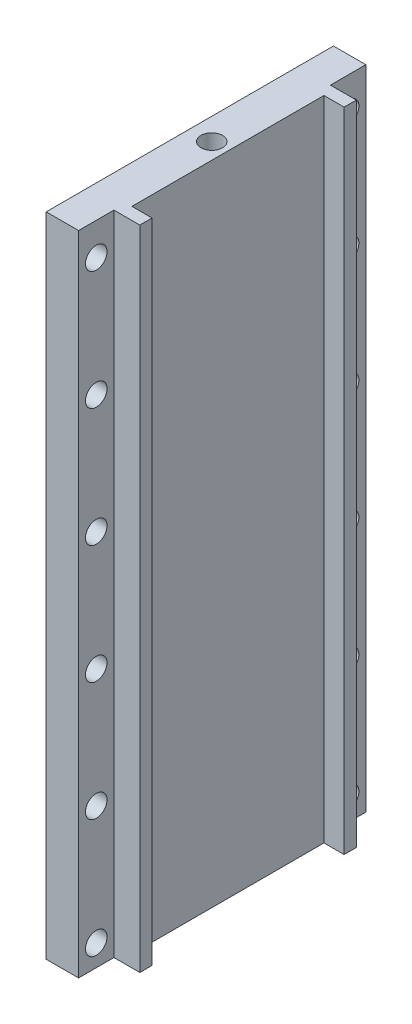
ISO-10303-21;
HEADER;
FILE_DESCRIPTION(('STEP AP214'),'2;1');
FILE_NAME('part.step','',(''),(''),'','','');
FILE_SCHEMA(('AUTOMOTIVE_DESIGN { 1 0 10303 214 1 1 1 1 }'));
ENDSEC;
DATA;
#1=APPLICATION_CONTEXT('core data for automotive mechanical design processes');
#2=APPLICATION_PROTOCOL_DEFINITION('international standard','automotive_design',2000,#1);
#3=PRODUCT_CONTEXT('',#1,'mechanical');
#4=PRODUCT('Part','Part','',(#3));
#5=PRODUCT_RELATED_PRODUCT_CATEGORY('part','',(#4));
#6=PRODUCT_DEFINITION_FORMATION('','',#4);
#7=PRODUCT_DEFINITION_CONTEXT('part definition',#1,'design');
#8=PRODUCT_DEFINITION('design','',#6,#7);
#9=PRODUCT_DEFINITION_SHAPE('','',#8);
#10=(LENGTH_UNIT() NAMED_UNIT(*) SI_UNIT(.MILLI.,.METRE.));
#11=(NAMED_UNIT(*) PLANE_ANGLE_UNIT() SI_UNIT($,.RADIAN.));
#12=(NAMED_UNIT(*) SI_UNIT($,.STERADIAN.) SOLID_ANGLE_UNIT());
#13=UNCERTAINTY_MEASURE_WITH_UNIT(LENGTH_MEASURE(1.E-05),#10,'distance_accuracy_value','');
#14=(GEOMETRIC_REPRESENTATION_CONTEXT(3) GLOBAL_UNCERTAINTY_ASSIGNED_CONTEXT((#13)) GLOBAL_UNIT_ASSIGNED_CONTEXT((#10,
#11,#12)) REPRESENTATION_CONTEXT('',''));
#15=CARTESIAN_POINT('',(0.,0.,0.));
#16=DIRECTION('',(0.,0.,1.));
#17=DIRECTION('',(1.,0.,0.));
#18=AXIS2_PLACEMENT_3D('',#15,#16,#17);
#19=CARTESIAN_POINT('',(0.,300.,0.));
#20=DIRECTION('',(0.,0.,-1.));
#21=DIRECTION('',(-1.,0.,0.));
#22=AXIS2_PLACEMENT_3D('',#19,#20,#21);
#23=PLANE('',#22);
#24=DIRECTION('',(1.,0.,0.));
#25=VECTOR('',#24,1.);
#26=CARTESIAN_POINT('',(0.,0.,0.));
#27=LINE('',#26,#25);
#28=CARTESIAN_POINT('',(0.,0.,0.));
#29=VERTEX_POINT('',#28);
#30=CARTESIAN_POINT('',(15.,0.,0.));
#31=VERTEX_POINT('',#30);
#32=EDGE_CURVE('E164',#29,#31,#27,.T.);
#33=ORIENTED_EDGE('',*,*,#32,.T.);
#34=DIRECTION('',(0.,-1.,0.));
#35=VECTOR('',#34,1.);
#36=CARTESIAN_POINT('',(15.,300.,0.));
#37=LINE('',#36,#35);
#38=CARTESIAN_POINT('',(15.,300.,0.));
#39=VERTEX_POINT('',#38);
#40=EDGE_CURVE('E13',#39,#31,#37,.T.);
#41=ORIENTED_EDGE('',*,*,#40,.F.);
#42=DIRECTION('',(1.,0.,0.));
#43=VECTOR('',#42,1.);
#44=CARTESIAN_POINT('',(0.,300.,0.));
#45=LINE('',#44,#43);
#46=CARTESIAN_POINT('',(0.,300.,0.));
#47=VERTEX_POINT('',#46);
#48=EDGE_CURVE('E187',#47,#39,#45,.T.);
#49=ORIENTED_EDGE('',*,*,#48,.F.);
#50=DIRECTION('',(0.,-1.,0.));
#51=VECTOR('',#50,1.);
#52=CARTESIAN_POINT('',(0.,300.,0.));
#53=LINE('',#52,#51);
#54=EDGE_CURVE('E160',#47,#29,#53,.T.);
#55=ORIENTED_EDGE('',*,*,#54,.T.);
#56=EDGE_LOOP('',(#33,#41,#49,#55));
#57=FACE_BOUND('',#56,.T.);
#58=ADVANCED_FACE('F44',(#57),#23,.F.);
#59=CARTESIAN_POINT('',(15.,300.,0.));
#60=DIRECTION('',(-1.,0.,0.));
#61=DIRECTION('',(0.,0.,1.));
#62=AXIS2_PLACEMENT_3D('',#59,#60,#61);
#63=PLANE('',#62);
#64=CARTESIAN_POINT('',(15.,230.,-8.19750000000057));
#65=DIRECTION('',(1.,0.,0.));
#66=DIRECTION('',(0.,0.,-1.));
#67=AXIS2_PLACEMENT_3D('',#64,#65,#66);
#68=CIRCLE('',#67,5.);
#69=CARTESIAN_POINT('',(15.,230.,-13.1975000000006));
#70=VERTEX_POINT('',#69);
#71=EDGE_CURVE('E346',#70,#70,#68,.T.);
#72=ORIENTED_EDGE('',*,*,#71,.F.);
#73=EDGE_LOOP('',(#72));
#74=FACE_BOUND('',#73,.T.);
#75=CARTESIAN_POINT('',(15.,175.,-8.19750000000115));
#76=DIRECTION('',(1.,0.,0.));
#77=DIRECTION('',(0.,0.,-1.));
#78=AXIS2_PLACEMENT_3D('',#75,#76,#77);
#79=CIRCLE('',#78,5.);
#80=CARTESIAN_POINT('',(15.,175.,-13.1975000000011));
#81=VERTEX_POINT('',#80);
#82=EDGE_CURVE('E356',#81,#81,#79,.T.);
#83=ORIENTED_EDGE('',*,*,#82,.F.);
#84=EDGE_LOOP('',(#83));
#85=FACE_BOUND('',#84,.T.);
#86=CARTESIAN_POINT('',(15.,120.,-8.19750000000172));
#87=DIRECTION('',(1.,0.,0.));
#88=DIRECTION('',(0.,0.,-1.));
#89=AXIS2_PLACEMENT_3D('',#86,#87,#88);
#90=CIRCLE('',#89,5.);
#91=CARTESIAN_POINT('',(15.,120.,-13.1975000000017));
#92=VERTEX_POINT('',#91);
#93=EDGE_CURVE('E362',#92,#92,#90,.T.);
#94=ORIENTED_EDGE('',*,*,#93,.F.);
#95=EDGE_LOOP('',(#94));
#96=FACE_BOUND('',#95,.T.);
#97=CARTESIAN_POINT('',(15.,65.,-8.1975000000023));
#98=DIRECTION('',(1.,0.,0.));
#99=DIRECTION('',(0.,0.,-1.));
#100=AXIS2_PLACEMENT_3D('',#97,#98,#99);
#101=CIRCLE('',#100,5.);
#102=CARTESIAN_POINT('',(15.,65.,-13.1975000000023));
#103=VERTEX_POINT('',#102);
#104=EDGE_CURVE('E368',#103,#103,#101,.T.);
#105=ORIENTED_EDGE('',*,*,#104,.F.);
#106=EDGE_LOOP('',(#105));
#107=FACE_BOUND('',#106,.T.);
#108=CARTESIAN_POINT('',(15.,9.99999999999995,-8.19750000000287));
#109=DIRECTION('',(1.,0.,0.));
#110=DIRECTION('',(0.,0.,-1.));
#111=AXIS2_PLACEMENT_3D('',#108,#109,#110);
#112=CIRCLE('',#111,5.);
#113=CARTESIAN_POINT('',(15.,9.99999999999995,-13.1975000000029));
#114=VERTEX_POINT('',#113);
#115=EDGE_CURVE('E374',#114,#114,#112,.T.);
#116=ORIENTED_EDGE('',*,*,#115,.F.);
#117=EDGE_LOOP('',(#116));
#118=FACE_BOUND('',#117,.T.);
#119=CARTESIAN_POINT('',(15.,285.,-8.19749999999999));
#120=DIRECTION('',(1.,0.,0.));
#121=DIRECTION('',(0.,0.,-1.));
#122=AXIS2_PLACEMENT_3D('',#119,#120,#121);
#123=CIRCLE('',#122,5.);
#124=CARTESIAN_POINT('',(15.,285.,-13.1975));
#125=VERTEX_POINT('',#124);
#126=EDGE_CURVE('E339',#125,#125,#123,.T.);
#127=ORIENTED_EDGE('',*,*,#126,.F.);
#128=EDGE_LOOP('',(#127));
#129=FACE_BOUND('',#128,.T.);
#130=DIRECTION('',(0.,0.,-1.));
#131=VECTOR('',#130,1.);
#132=CARTESIAN_POINT('',(15.,0.,0.));
#133=LINE('',#132,#131);
#134=CARTESIAN_POINT('',(15.,0.,-16.395));
#135=VERTEX_POINT('',#134);
#136=EDGE_CURVE('E167',#31,#135,#133,.T.);
#137=ORIENTED_EDGE('',*,*,#136,.T.);
#138=DIRECTION('',(0.,-1.,0.));
#139=VECTOR('',#138,1.);
#140=CARTESIAN_POINT('',(15.,300.,-16.395));
#141=LINE('',#140,#139);
#142=CARTESIAN_POINT('',(15.,300.,-16.395));
#143=VERTEX_POINT('',#142);
#144=EDGE_CURVE('E52',#143,#135,#141,.T.);
#145=ORIENTED_EDGE('',*,*,#144,.F.);
#146=DIRECTION('',(0.,0.,-1.));
#147=VECTOR('',#146,1.);
#148=CARTESIAN_POINT('',(15.,300.,0.));
#149=LINE('',#148,#147);
#150=EDGE_CURVE('E115',#39,#143,#149,.T.);
#151=ORIENTED_EDGE('',*,*,#150,.F.);
#152=ORIENTED_EDGE('',*,*,#40,.T.);
#153=EDGE_LOOP('',(#137,#145,#151,#152));
#154=FACE_BOUND('',#153,.T.);
#155=ADVANCED_FACE('F271',(#74,#85,#96,#107,#118,#129,#154),#63,.F.);
#156=CARTESIAN_POINT('',(15.,300.,-16.395));
#157=DIRECTION('',(0.,0.,-1.));
#158=DIRECTION('',(-1.,0.,0.));
#159=AXIS2_PLACEMENT_3D('',#156,#157,#158);
#160=PLANE('',#159);
#161=DIRECTION('',(1.,0.,0.));
#162=VECTOR('',#161,1.);
#163=CARTESIAN_POINT('',(15.,0.,-16.395));
#164=LINE('',#163,#162);
#165=CARTESIAN_POINT('',(27.,0.,-16.395));
#166=VERTEX_POINT('',#165);
#167=EDGE_CURVE('E170',#135,#166,#164,.T.);
#168=ORIENTED_EDGE('',*,*,#167,.T.);
#169=DIRECTION('',(0.,-1.,0.));
#170=VECTOR('',#169,1.);
#171=CARTESIAN_POINT('',(27.,300.,-16.395));
#172=LINE('',#171,#170);
#173=CARTESIAN_POINT('',(27.,300.,-16.395));
#174=VERTEX_POINT('',#173);
#175=EDGE_CURVE('E206',#174,#166,#172,.T.);
#176=ORIENTED_EDGE('',*,*,#175,.F.);
#177=DIRECTION('',(1.,0.,0.));
#178=VECTOR('',#177,1.);
#179=CARTESIAN_POINT('',(15.,300.,-16.395));
#180=LINE('',#179,#178);
#181=EDGE_CURVE('E214',#143,#174,#180,.T.);
#182=ORIENTED_EDGE('',*,*,#181,.F.);
#183=ORIENTED_EDGE('',*,*,#144,.T.);
#184=EDGE_LOOP('',(#168,#176,#182,#183));
#185=FACE_BOUND('',#184,.T.);
#186=ADVANCED_FACE('F212',(#185),#160,.F.);
#187=CARTESIAN_POINT('',(27.,300.,-16.395));
#188=DIRECTION('',(-1.,0.,0.));
#189=DIRECTION('',(0.,0.,1.));
#190=AXIS2_PLACEMENT_3D('',#187,#188,#189);
#191=PLANE('',#190);
#192=DIRECTION('',(0.,0.,-1.));
#193=VECTOR('',#192,1.);
#194=CARTESIAN_POINT('',(27.,0.,-16.395));
#195=LINE('',#194,#193);
#196=CARTESIAN_POINT('',(27.,0.,-22.06));
#197=VERTEX_POINT('',#196);
#198=EDGE_CURVE('E172',#166,#197,#195,.T.);
#199=ORIENTED_EDGE('',*,*,#198,.T.);
#200=DIRECTION('',(0.,-1.,0.));
#201=VECTOR('',#200,1.);
#202=CARTESIAN_POINT('',(27.,300.,-22.06));
#203=LINE('',#202,#201);
#204=CARTESIAN_POINT('',(27.,300.,-22.06));
#205=VERTEX_POINT('',#204);
#206=EDGE_CURVE('E203',#205,#197,#203,.T.);
#207=ORIENTED_EDGE('',*,*,#206,.F.);
#208=DIRECTION('',(0.,0.,-1.));
#209=VECTOR('',#208,1.);
#210=CARTESIAN_POINT('',(27.,300.,-16.395));
#211=LINE('',#210,#209);
#212=EDGE_CURVE('E232',#174,#205,#211,.T.);
#213=ORIENTED_EDGE('',*,*,#212,.F.);
#214=ORIENTED_EDGE('',*,*,#175,.T.);
#215=EDGE_LOOP('',(#199,#207,#213,#214));
#216=FACE_BOUND('',#215,.T.);
#217=ADVANCED_FACE('F223',(#216),#191,.F.);
#218=CARTESIAN_POINT('',(17.665,300.,-22.06));
#219=DIRECTION('',(0.,0.,1.));
#220=DIRECTION('',(1.,0.,0.));
#221=AXIS2_PLACEMENT_3D('',#218,#219,#220);
#222=PLANE('',#221);
#223=DIRECTION('',(-1.,0.,0.));
#224=VECTOR('',#223,1.);
#225=CARTESIAN_POINT('',(17.665,0.,-22.06));
#226=LINE('',#225,#224);
#227=CARTESIAN_POINT('',(17.665,0.,-22.06));
#228=VERTEX_POINT('',#227);
#229=EDGE_CURVE('E174',#197,#228,#226,.T.);
#230=ORIENTED_EDGE('',*,*,#229,.T.);
#231=DIRECTION('',(0.,-1.,0.));
#232=VECTOR('',#231,1.);
#233=CARTESIAN_POINT('',(17.665,300.,-22.06));
#234=LINE('',#233,#232);
#235=CARTESIAN_POINT('',(17.665,300.,-22.06));
#236=VERTEX_POINT('',#235);
#237=EDGE_CURVE('E200',#236,#228,#234,.T.);
#238=ORIENTED_EDGE('',*,*,#237,.F.);
#239=DIRECTION('',(-1.,0.,0.));
#240=VECTOR('',#239,1.);
#241=CARTESIAN_POINT('',(17.665,300.,-22.06));
#242=LINE('',#241,#240);
#243=EDGE_CURVE('E229',#205,#236,#242,.T.);
#244=ORIENTED_EDGE('',*,*,#243,.F.);
#245=ORIENTED_EDGE('',*,*,#206,.T.);
#246=EDGE_LOOP('',(#230,#238,#244,#245));
#247=FACE_BOUND('',#246,.T.);
#248=ADVANCED_FACE('F227',(#247),#222,.F.);
#249=CARTESIAN_POINT('',(17.665,300.,-111.06));
#250=DIRECTION('',(-1.,0.,0.));
#251=DIRECTION('',(0.,0.,1.));
#252=AXIS2_PLACEMENT_3D('',#249,#250,#251);
#253=PLANE('',#252);
#254=DIRECTION('',(0.,0.,-1.));
#255=VECTOR('',#254,1.);
#256=CARTESIAN_POINT('',(17.665,0.,-111.06));
#257=LINE('',#256,#255);
#258=CARTESIAN_POINT('',(17.665,0.,-111.06));
#259=VERTEX_POINT('',#258);
#260=EDGE_CURVE('E176',#228,#259,#257,.T.);
#261=ORIENTED_EDGE('',*,*,#260,.T.);
#262=DIRECTION('',(0.,-1.,0.));
#263=VECTOR('',#262,1.);
#264=CARTESIAN_POINT('',(17.665,300.,-111.06));
#265=LINE('',#264,#263);
#266=CARTESIAN_POINT('',(17.665,300.,-111.06));
#267=VERTEX_POINT('',#266);
#268=EDGE_CURVE('E197',#267,#259,#265,.T.);
#269=ORIENTED_EDGE('',*,*,#268,.F.);
#270=DIRECTION('',(0.,0.,-1.));
#271=VECTOR('',#270,1.);
#272=CARTESIAN_POINT('',(17.665,300.,-111.06));
#273=LINE('',#272,#271);
#274=EDGE_CURVE('E231',#236,#267,#273,.T.);
#275=ORIENTED_EDGE('',*,*,#274,.F.);
#276=ORIENTED_EDGE('',*,*,#237,.T.);
#277=EDGE_LOOP('',(#261,#269,#275,#276));
#278=FACE_BOUND('',#277,.T.);
#279=ADVANCED_FACE('F288',(#278),#253,.F.);
#280=CARTESIAN_POINT('',(27.,300.,-111.06));
#281=DIRECTION('',(0.,0.,-1.));
#282=DIRECTION('',(-1.,0.,0.));
#283=AXIS2_PLACEMENT_3D('',#280,#281,#282);
#284=PLANE('',#283);
#285=DIRECTION('',(1.,0.,0.));
#286=VECTOR('',#285,1.);
#287=CARTESIAN_POINT('',(27.,0.,-111.06));
#288=LINE('',#287,#286);
#289=CARTESIAN_POINT('',(27.,0.,-111.06));
#290=VERTEX_POINT('',#289);
#291=EDGE_CURVE('E178',#259,#290,#288,.T.);
#292=ORIENTED_EDGE('',*,*,#291,.T.);
#293=DIRECTION('',(0.,-1.,0.));
#294=VECTOR('',#293,1.);
#295=CARTESIAN_POINT('',(27.,300.,-111.06));
#296=LINE('',#295,#294);
#297=CARTESIAN_POINT('',(27.,300.,-111.06));
#298=VERTEX_POINT('',#297);
#299=EDGE_CURVE('E194',#298,#290,#296,.T.);
#300=ORIENTED_EDGE('',*,*,#299,.F.);
#301=DIRECTION('',(1.,0.,0.));
#302=VECTOR('',#301,1.);
#303=CARTESIAN_POINT('',(27.,300.,-111.06));
#304=LINE('',#303,#302);
#305=EDGE_CURVE('E234',#267,#298,#304,.T.);
#306=ORIENTED_EDGE('',*,*,#305,.F.);
#307=ORIENTED_EDGE('',*,*,#268,.T.);
#308=EDGE_LOOP('',(#292,#300,#306,#307));
#309=FACE_BOUND('',#308,.T.);
#310=ADVANCED_FACE('F291',(#309),#284,.F.);
#311=CARTESIAN_POINT('',(27.,300.,-116.725));
#312=DIRECTION('',(-1.,0.,0.));
#313=DIRECTION('',(0.,0.,1.));
#314=AXIS2_PLACEMENT_3D('',#311,#312,#313);
#315=PLANE('',#314);
#316=DIRECTION('',(0.,0.,-1.));
#317=VECTOR('',#316,1.);
#318=CARTESIAN_POINT('',(27.,0.,-116.725));
#319=LINE('',#318,#317);
#320=CARTESIAN_POINT('',(27.,0.,-116.725));
#321=VERTEX_POINT('',#320);
#322=EDGE_CURVE('E180',#290,#321,#319,.T.);
#323=ORIENTED_EDGE('',*,*,#322,.T.);
#324=DIRECTION('',(0.,-1.,0.));
#325=VECTOR('',#324,1.);
#326=CARTESIAN_POINT('',(27.,300.,-116.725));
#327=LINE('',#326,#325);
#328=CARTESIAN_POINT('',(27.,300.,-116.725));
#329=VERTEX_POINT('',#328);
#330=EDGE_CURVE('E191',#329,#321,#327,.T.);
#331=ORIENTED_EDGE('',*,*,#330,.F.);
#332=DIRECTION('',(0.,0.,-1.));
#333=VECTOR('',#332,1.);
#334=CARTESIAN_POINT('',(27.,300.,-116.725));
#335=LINE('',#334,#333);
#336=EDGE_CURVE('E240',#298,#329,#335,.T.);
#337=ORIENTED_EDGE('',*,*,#336,.F.);
#338=ORIENTED_EDGE('',*,*,#299,.T.);
#339=EDGE_LOOP('',(#323,#331,#337,#338));
#340=FACE_BOUND('',#339,.T.);
#341=ADVANCED_FACE('F246',(#340),#315,.F.);
#342=CARTESIAN_POINT('',(15.,300.,-116.725));
#343=DIRECTION('',(0.,0.,1.));
#344=DIRECTION('',(1.,0.,0.));
#345=AXIS2_PLACEMENT_3D('',#342,#343,#344);
#346=PLANE('',#345);
#347=DIRECTION('',(-1.,0.,0.));
#348=VECTOR('',#347,1.);
#349=CARTESIAN_POINT('',(15.,0.,-116.725));
#350=LINE('',#349,#348);
#351=CARTESIAN_POINT('',(15.,0.,-116.725));
#352=VERTEX_POINT('',#351);
#353=EDGE_CURVE('E182',#321,#352,#350,.T.);
#354=ORIENTED_EDGE('',*,*,#353,.T.);
#355=DIRECTION('',(0.,-1.,0.));
#356=VECTOR('',#355,1.);
#357=CARTESIAN_POINT('',(15.,300.,-116.725));
#358=LINE('',#357,#356);
#359=CARTESIAN_POINT('',(15.,300.,-116.725));
#360=VERTEX_POINT('',#359);
#361=EDGE_CURVE('E155',#360,#352,#358,.T.);
#362=ORIENTED_EDGE('',*,*,#361,.F.);
#363=DIRECTION('',(-1.,0.,0.));
#364=VECTOR('',#363,1.);
#365=CARTESIAN_POINT('',(15.,300.,-116.725));
#366=LINE('',#365,#364);
#367=EDGE_CURVE('E146',#329,#360,#366,.T.);
#368=ORIENTED_EDGE('',*,*,#367,.F.);
#369=ORIENTED_EDGE('',*,*,#330,.T.);
#370=EDGE_LOOP('',(#354,#362,#368,#369));
#371=FACE_BOUND('',#370,.T.);
#372=ADVANCED_FACE('F250',(#371),#346,.F.);
#373=CARTESIAN_POINT('',(15.,300.,-133.12));
#374=DIRECTION('',(-1.,0.,0.));
#375=DIRECTION('',(0.,0.,1.));
#376=AXIS2_PLACEMENT_3D('',#373,#374,#375);
#377=PLANE('',#376);
#378=CARTESIAN_POINT('',(15.,9.99999999999995,-124.922499999997));
#379=DIRECTION('',(1.,0.,0.));
#380=DIRECTION('',(0.,0.,1.));
#381=AXIS2_PLACEMENT_3D('',#378,#379,#380);
#382=CIRCLE('',#381,4.99999999999999);
#383=CARTESIAN_POINT('',(15.,9.99999999999995,-119.922499999997));
#384=VERTEX_POINT('',#383);
#385=EDGE_CURVE('E306',#384,#384,#382,.T.);
#386=ORIENTED_EDGE('',*,*,#385,.F.);
#387=EDGE_LOOP('',(#386));
#388=FACE_BOUND('',#387,.T.);
#389=CARTESIAN_POINT('',(15.,65.,-124.922499999998));
#390=DIRECTION('',(1.,0.,0.));
#391=DIRECTION('',(0.,0.,1.));
#392=AXIS2_PLACEMENT_3D('',#389,#390,#391);
#393=CIRCLE('',#392,5.00000000000001);
#394=CARTESIAN_POINT('',(15.,65.,-119.922499999998));
#395=VERTEX_POINT('',#394);
#396=EDGE_CURVE('E310',#395,#395,#393,.T.);
#397=ORIENTED_EDGE('',*,*,#396,.F.);
#398=EDGE_LOOP('',(#397));
#399=FACE_BOUND('',#398,.T.);
#400=CARTESIAN_POINT('',(15.,120.,-124.922499999998));
#401=DIRECTION('',(1.,0.,0.));
#402=DIRECTION('',(0.,0.,1.));
#403=AXIS2_PLACEMENT_3D('',#400,#401,#402);
#404=CIRCLE('',#403,5.00000000000001);
#405=CARTESIAN_POINT('',(15.,120.,-119.922499999998));
#406=VERTEX_POINT('',#405);
#407=EDGE_CURVE('E314',#406,#406,#404,.T.);
#408=ORIENTED_EDGE('',*,*,#407,.F.);
#409=EDGE_LOOP('',(#408));
#410=FACE_BOUND('',#409,.T.);
#411=CARTESIAN_POINT('',(15.,175.,-124.922499999999));
#412=DIRECTION('',(1.,0.,0.));
#413=DIRECTION('',(0.,0.,1.));
#414=AXIS2_PLACEMENT_3D('',#411,#412,#413);
#415=CIRCLE('',#414,5.00000000000001);
#416=CARTESIAN_POINT('',(15.,175.,-119.922499999999));
#417=VERTEX_POINT('',#416);
#418=EDGE_CURVE('E318',#417,#417,#415,.T.);
#419=ORIENTED_EDGE('',*,*,#418,.F.);
#420=EDGE_LOOP('',(#419));
#421=FACE_BOUND('',#420,.T.);
#422=CARTESIAN_POINT('',(15.,230.,-124.922499999999));
#423=DIRECTION('',(1.,0.,0.));
#424=DIRECTION('',(0.,0.,1.));
#425=AXIS2_PLACEMENT_3D('',#422,#423,#424);
#426=CIRCLE('',#425,4.99999999999999);
#427=CARTESIAN_POINT('',(15.,230.,-119.922499999999));
#428=VERTEX_POINT('',#427);
#429=EDGE_CURVE('E322',#428,#428,#426,.T.);
#430=ORIENTED_EDGE('',*,*,#429,.F.);
#431=EDGE_LOOP('',(#430));
#432=FACE_BOUND('',#431,.T.);
#433=CARTESIAN_POINT('',(15.,285.,-124.9225));
#434=DIRECTION('',(1.,0.,0.));
#435=DIRECTION('',(0.,0.,1.));
#436=AXIS2_PLACEMENT_3D('',#433,#434,#435);
#437=CIRCLE('',#436,5.00000000000001);
#438=CARTESIAN_POINT('',(15.,285.,-119.9225));
#439=VERTEX_POINT('',#438);
#440=EDGE_CURVE('E325',#439,#439,#437,.T.);
#441=ORIENTED_EDGE('',*,*,#440,.F.);
#442=EDGE_LOOP('',(#441));
#443=FACE_BOUND('',#442,.T.);
#444=DIRECTION('',(0.,0.,-1.));
#445=VECTOR('',#444,1.);
#446=CARTESIAN_POINT('',(15.,0.,-133.12));
#447=LINE('',#446,#445);
#448=CARTESIAN_POINT('',(15.,0.,-133.12));
#449=VERTEX_POINT('',#448);
#450=EDGE_CURVE('E154',#352,#449,#447,.T.);
#451=ORIENTED_EDGE('',*,*,#450,.T.);
#452=DIRECTION('',(0.,-1.,0.));
#453=VECTOR('',#452,1.);
#454=CARTESIAN_POINT('',(15.,300.,-133.12));
#455=LINE('',#454,#453);
#456=CARTESIAN_POINT('',(15.,300.,-133.12));
#457=VERTEX_POINT('',#456);
#458=EDGE_CURVE('E151',#457,#449,#455,.T.);
#459=ORIENTED_EDGE('',*,*,#458,.F.);
#460=DIRECTION('',(0.,0.,-1.));
#461=VECTOR('',#460,1.);
#462=CARTESIAN_POINT('',(15.,300.,-133.12));
#463=LINE('',#462,#461);
#464=EDGE_CURVE('E140',#360,#457,#463,.T.);
#465=ORIENTED_EDGE('',*,*,#464,.F.);
#466=ORIENTED_EDGE('',*,*,#361,.T.);
#467=EDGE_LOOP('',(#451,#459,#465,#466));
#468=FACE_BOUND('',#467,.T.);
#469=ADVANCED_FACE('F152',(#388,#399,#410,#421,#432,#443,#468),#377,.F.);
#470=CARTESIAN_POINT('',(0.,300.,-133.12));
#471=DIRECTION('',(0.,0.,1.));
#472=DIRECTION('',(1.,0.,0.));
#473=AXIS2_PLACEMENT_3D('',#470,#471,#472);
#474=PLANE('',#473);
#475=DIRECTION('',(-1.,0.,0.));
#476=VECTOR('',#475,1.);
#477=CARTESIAN_POINT('',(0.,0.,-133.12));
#478=LINE('',#477,#476);
#479=CARTESIAN_POINT('',(0.,0.,-133.12));
#480=VERTEX_POINT('',#479);
#481=EDGE_CURVE('E101',#449,#480,#478,.T.);
#482=ORIENTED_EDGE('',*,*,#481,.T.);
#483=DIRECTION('',(0.,-1.,0.));
#484=VECTOR('',#483,1.);
#485=CARTESIAN_POINT('',(0.,300.,-133.12));
#486=LINE('',#485,#484);
#487=CARTESIAN_POINT('',(0.,300.,-133.12));
#488=VERTEX_POINT('',#487);
#489=EDGE_CURVE('E156',#488,#480,#486,.T.);
#490=ORIENTED_EDGE('',*,*,#489,.F.);
#491=DIRECTION('',(-1.,0.,0.));
#492=VECTOR('',#491,1.);
#493=CARTESIAN_POINT('',(0.,300.,-133.12));
#494=LINE('',#493,#492);
#495=EDGE_CURVE('E144',#457,#488,#494,.T.);
#496=ORIENTED_EDGE('',*,*,#495,.F.);
#497=ORIENTED_EDGE('',*,*,#458,.T.);
#498=EDGE_LOOP('',(#482,#490,#496,#497));
#499=FACE_BOUND('',#498,.T.);
#500=ADVANCED_FACE('F158',(#499),#474,.F.);
#501=CARTESIAN_POINT('',(0.,300.,0.));
#502=DIRECTION('',(1.,0.,0.));
#503=DIRECTION('',(0.,0.,-1.));
#504=AXIS2_PLACEMENT_3D('',#501,#502,#503);
#505=PLANE('',#504);
#506=CARTESIAN_POINT('',(0.,230.,-8.19750000000057));
#507=DIRECTION('',(1.,0.,0.));
#508=DIRECTION('',(0.,0.,-1.));
#509=AXIS2_PLACEMENT_3D('',#506,#507,#508);
#510=CIRCLE('',#509,5.);
#511=CARTESIAN_POINT('',(0.,230.,-13.1975000000006));
#512=VERTEX_POINT('',#511);
#513=EDGE_CURVE('E342',#512,#512,#510,.T.);
#514=ORIENTED_EDGE('',*,*,#513,.T.);
#515=EDGE_LOOP('',(#514));
#516=FACE_BOUND('',#515,.T.);
#517=CARTESIAN_POINT('',(0.,175.,-8.19750000000115));
#518=DIRECTION('',(1.,0.,0.));
#519=DIRECTION('',(0.,0.,-1.));
#520=AXIS2_PLACEMENT_3D('',#517,#518,#519);
#521=CIRCLE('',#520,5.);
#522=CARTESIAN_POINT('',(0.,175.,-13.1975000000011));
#523=VERTEX_POINT('',#522);
#524=EDGE_CURVE('E350',#523,#523,#521,.T.);
#525=ORIENTED_EDGE('',*,*,#524,.T.);
#526=EDGE_LOOP('',(#525));
#527=FACE_BOUND('',#526,.T.);
#528=CARTESIAN_POINT('',(0.,120.,-8.19750000000172));
#529=DIRECTION('',(1.,0.,0.));
#530=DIRECTION('',(0.,0.,-1.));
#531=AXIS2_PLACEMENT_3D('',#528,#529,#530);
#532=CIRCLE('',#531,5.);
#533=CARTESIAN_POINT('',(0.,120.,-13.1975000000017));
#534=VERTEX_POINT('',#533);
#535=EDGE_CURVE('E359',#534,#534,#532,.T.);
#536=ORIENTED_EDGE('',*,*,#535,.T.);
#537=EDGE_LOOP('',(#536));
#538=FACE_BOUND('',#537,.T.);
#539=CARTESIAN_POINT('',(0.,65.,-8.1975000000023));
#540=DIRECTION('',(1.,0.,0.));
#541=DIRECTION('',(0.,0.,-1.));
#542=AXIS2_PLACEMENT_3D('',#539,#540,#541);
#543=CIRCLE('',#542,5.);
#544=CARTESIAN_POINT('',(0.,65.,-13.1975000000023));
#545=VERTEX_POINT('',#544);
#546=EDGE_CURVE('E365',#545,#545,#543,.T.);
#547=ORIENTED_EDGE('',*,*,#546,.T.);
#548=EDGE_LOOP('',(#547));
#549=FACE_BOUND('',#548,.T.);
#550=CARTESIAN_POINT('',(0.,9.99999999999995,-8.19750000000288));
#551=DIRECTION('',(1.,0.,0.));
#552=DIRECTION('',(0.,0.,-1.));
#553=AXIS2_PLACEMENT_3D('',#550,#551,#552);
#554=CIRCLE('',#553,5.);
#555=CARTESIAN_POINT('',(0.,9.99999999999995,-13.1975000000029));
#556=VERTEX_POINT('',#555);
#557=EDGE_CURVE('E371',#556,#556,#554,.T.);
#558=ORIENTED_EDGE('',*,*,#557,.T.);
#559=EDGE_LOOP('',(#558));
#560=FACE_BOUND('',#559,.T.);
#561=CARTESIAN_POINT('',(0.,9.99999999999995,-124.922499999997));
#562=DIRECTION('',(1.,0.,0.));
#563=DIRECTION('',(0.,0.,1.));
#564=AXIS2_PLACEMENT_3D('',#561,#562,#563);
#565=CIRCLE('',#564,4.99999999999999);
#566=CARTESIAN_POINT('',(0.,9.99999999999995,-119.922499999997));
#567=VERTEX_POINT('',#566);
#568=EDGE_CURVE('E377',#567,#567,#565,.T.);
#569=ORIENTED_EDGE('',*,*,#568,.T.);
#570=EDGE_LOOP('',(#569));
#571=FACE_BOUND('',#570,.T.);
#572=CARTESIAN_POINT('',(0.,65.,-124.922499999998));
#573=DIRECTION('',(1.,0.,0.));
#574=DIRECTION('',(0.,0.,1.));
#575=AXIS2_PLACEMENT_3D('',#572,#573,#574);
#576=CIRCLE('',#575,5.00000000000001);
#577=CARTESIAN_POINT('',(0.,65.,-119.922499999998));
#578=VERTEX_POINT('',#577);
#579=EDGE_CURVE('E381',#578,#578,#576,.T.);
#580=ORIENTED_EDGE('',*,*,#579,.T.);
#581=EDGE_LOOP('',(#580));
#582=FACE_BOUND('',#581,.T.);
#583=CARTESIAN_POINT('',(0.,120.,-124.922499999998));
#584=DIRECTION('',(1.,0.,0.));
#585=DIRECTION('',(0.,0.,1.));
#586=AXIS2_PLACEMENT_3D('',#583,#584,#585);
#587=CIRCLE('',#586,5.00000000000001);
#588=CARTESIAN_POINT('',(0.,120.,-119.922499999998));
#589=VERTEX_POINT('',#588);
#590=EDGE_CURVE('E385',#589,#589,#587,.T.);
#591=ORIENTED_EDGE('',*,*,#590,.T.);
#592=EDGE_LOOP('',(#591));
#593=FACE_BOUND('',#592,.T.);
#594=CARTESIAN_POINT('',(0.,175.,-124.922499999999));
#595=DIRECTION('',(1.,0.,0.));
#596=DIRECTION('',(0.,0.,1.));
#597=AXIS2_PLACEMENT_3D('',#594,#595,#596);
#598=CIRCLE('',#597,5.00000000000001);
#599=CARTESIAN_POINT('',(0.,175.,-119.922499999999));
#600=VERTEX_POINT('',#599);
#601=EDGE_CURVE('E389',#600,#600,#598,.T.);
#602=ORIENTED_EDGE('',*,*,#601,.T.);
#603=EDGE_LOOP('',(#602));
#604=FACE_BOUND('',#603,.T.);
#605=CARTESIAN_POINT('',(0.,230.,-124.922499999999));
#606=DIRECTION('',(1.,0.,0.));
#607=DIRECTION('',(0.,0.,1.));
#608=AXIS2_PLACEMENT_3D('',#605,#606,#607);
#609=CIRCLE('',#608,4.99999999999999);
#610=CARTESIAN_POINT('',(0.,230.,-119.922499999999));
#611=VERTEX_POINT('',#610);
#612=EDGE_CURVE('E393',#611,#611,#609,.T.);
#613=ORIENTED_EDGE('',*,*,#612,.T.);
#614=EDGE_LOOP('',(#613));
#615=FACE_BOUND('',#614,.T.);
#616=CARTESIAN_POINT('',(0.,285.,-124.9225));
#617=DIRECTION('',(1.,0.,0.));
#618=DIRECTION('',(0.,0.,1.));
#619=AXIS2_PLACEMENT_3D('',#616,#617,#618);
#620=CIRCLE('',#619,5.00000000000001);
#621=CARTESIAN_POINT('',(0.,285.,-119.9225));
#622=VERTEX_POINT('',#621);
#623=EDGE_CURVE('E327',#622,#622,#620,.T.);
#624=ORIENTED_EDGE('',*,*,#623,.T.);
#625=EDGE_LOOP('',(#624));
#626=FACE_BOUND('',#625,.T.);
#627=CARTESIAN_POINT('',(0.,285.,-8.1975));
#628=DIRECTION('',(1.,0.,0.));
#629=DIRECTION('',(0.,0.,-1.));
#630=AXIS2_PLACEMENT_3D('',#627,#628,#629);
#631=CIRCLE('',#630,5.);
#632=CARTESIAN_POINT('',(0.,285.,-13.1975));
#633=VERTEX_POINT('',#632);
#634=EDGE_CURVE('E168',#633,#633,#631,.T.);
#635=ORIENTED_EDGE('',*,*,#634,.T.);
#636=EDGE_LOOP('',(#635));
#637=FACE_BOUND('',#636,.T.);
#638=DIRECTION('',(0.,0.,1.));
#639=VECTOR('',#638,1.);
#640=CARTESIAN_POINT('',(0.,0.,0.));
#641=LINE('',#640,#639);
#642=EDGE_CURVE('E107',#480,#29,#641,.T.);
#643=ORIENTED_EDGE('',*,*,#642,.T.);
#644=ORIENTED_EDGE('',*,*,#54,.F.);
#645=DIRECTION('',(0.,0.,1.));
#646=VECTOR('',#645,1.);
#647=CARTESIAN_POINT('',(0.,300.,0.));
#648=LINE('',#647,#646);
#649=EDGE_CURVE('E60',#488,#47,#648,.T.);
#650=ORIENTED_EDGE('',*,*,#649,.F.);
#651=ORIENTED_EDGE('',*,*,#489,.T.);
#652=EDGE_LOOP('',(#643,#644,#650,#651));
#653=FACE_BOUND('',#652,.T.);
#654=ADVANCED_FACE('F254',(#516,#527,#538,#549,#560,#571,#582,#593,#604,#615,#626,#637,#653),
#505,.F.);
#655=CARTESIAN_POINT('',(0.,300.,0.));
#656=DIRECTION('',(0.,1.,0.));
#657=DIRECTION('',(0.,0.,1.));
#658=AXIS2_PLACEMENT_3D('',#655,#656,#657);
#659=PLANE('',#658);
#660=CARTESIAN_POINT('',(10.165,300.,-66.5631648056588));
#661=DIRECTION('',(0.,1.,0.));
#662=DIRECTION('',(0.,0.,1.));
#663=AXIS2_PLACEMENT_3D('',#660,#661,#662);
#664=CIRCLE('',#663,5.00000000000001);
#665=CARTESIAN_POINT('',(10.165,300.,-61.5631648056588));
#666=VERTEX_POINT('',#665);
#667=EDGE_CURVE('E333',#666,#666,#664,.T.);
#668=ORIENTED_EDGE('',*,*,#667,.F.);
#669=EDGE_LOOP('',(#668));
#670=FACE_BOUND('',#669,.T.);
#671=ORIENTED_EDGE('',*,*,#48,.T.);
#672=ORIENTED_EDGE('',*,*,#150,.T.);
#673=ORIENTED_EDGE('',*,*,#181,.T.);
#674=ORIENTED_EDGE('',*,*,#212,.T.);
#675=ORIENTED_EDGE('',*,*,#243,.T.);
#676=ORIENTED_EDGE('',*,*,#274,.T.);
#677=ORIENTED_EDGE('',*,*,#305,.T.);
#678=ORIENTED_EDGE('',*,*,#336,.T.);
#679=ORIENTED_EDGE('',*,*,#367,.T.);
#680=ORIENTED_EDGE('',*,*,#464,.T.);
#681=ORIENTED_EDGE('',*,*,#495,.T.);
#682=ORIENTED_EDGE('',*,*,#649,.T.);
#683=EDGE_LOOP('',(#671,#672,#673,#674,#675,#676,#677,#678,#679,#680,#681,#682));
#684=FACE_BOUND('',#683,.T.);
#685=ADVANCED_FACE('F142',(#670,#684),#659,.T.);
#686=CARTESIAN_POINT('',(0.,0.,0.));
#687=DIRECTION('',(0.,1.,0.));
#688=DIRECTION('',(0.,0.,1.));
#689=AXIS2_PLACEMENT_3D('',#686,#687,#688);
#690=PLANE('',#689);
#691=CARTESIAN_POINT('',(10.165,0.,-66.56));
#692=DIRECTION('',(0.,-1.,0.));
#693=DIRECTION('',(0.,0.,-1.));
#694=AXIS2_PLACEMENT_3D('',#691,#692,#693);
#695=CIRCLE('',#694,5.00000000000001);
#696=CARTESIAN_POINT('',(10.165,0.,-71.56));
#697=VERTEX_POINT('',#696);
#698=EDGE_CURVE('E425',#697,#697,#695,.T.);
#699=ORIENTED_EDGE('',*,*,#698,.F.);
#700=EDGE_LOOP('',(#699));
#701=FACE_BOUND('',#700,.T.);
#702=ORIENTED_EDGE('',*,*,#32,.F.);
#703=ORIENTED_EDGE('',*,*,#642,.F.);
#704=ORIENTED_EDGE('',*,*,#481,.F.);
#705=ORIENTED_EDGE('',*,*,#450,.F.);
#706=ORIENTED_EDGE('',*,*,#353,.F.);
#707=ORIENTED_EDGE('',*,*,#322,.F.);
#708=ORIENTED_EDGE('',*,*,#291,.F.);
#709=ORIENTED_EDGE('',*,*,#260,.F.);
#710=ORIENTED_EDGE('',*,*,#229,.F.);
#711=ORIENTED_EDGE('',*,*,#198,.F.);
#712=ORIENTED_EDGE('',*,*,#167,.F.);
#713=ORIENTED_EDGE('',*,*,#136,.F.);
#714=EDGE_LOOP('',(#702,#703,#704,#705,#706,#707,#708,#709,#710,#711,#712,#713));
#715=FACE_BOUND('',#714,.T.);
#716=ADVANCED_FACE('F218',(#701,#715),#690,.F.);
#717=CARTESIAN_POINT('',(0.,285.,-8.1975));
#718=DIRECTION('',(1.,0.,0.));
#719=DIRECTION('',(0.,0.,-1.));
#720=AXIS2_PLACEMENT_3D('',#717,#718,#719);
#721=CYLINDRICAL_SURFACE('',#720,5.);
#722=ORIENTED_EDGE('',*,*,#634,.F.);
#723=EDGE_LOOP('',(#722));
#724=FACE_BOUND('',#723,.T.);
#725=ORIENTED_EDGE('',*,*,#126,.T.);
#726=EDGE_LOOP('',(#725));
#727=FACE_BOUND('',#726,.T.);
#728=ADVANCED_FACE('F409',(#724,#727),#721,.F.);
#729=CARTESIAN_POINT('',(0.,285.,-124.9225));
#730=DIRECTION('',(1.,0.,0.));
#731=DIRECTION('',(0.,0.,-1.));
#732=AXIS2_PLACEMENT_3D('',#729,#730,#731);
#733=CYLINDRICAL_SURFACE('',#732,5.00000000000001);
#734=ORIENTED_EDGE('',*,*,#623,.F.);
#735=EDGE_LOOP('',(#734));
#736=FACE_BOUND('',#735,.T.);
#737=ORIENTED_EDGE('',*,*,#440,.T.);
#738=EDGE_LOOP('',(#737));
#739=FACE_BOUND('',#738,.T.);
#740=ADVANCED_FACE('F399',(#736,#739),#733,.F.);
#741=CARTESIAN_POINT('',(0.,230.,-124.922499999999));
#742=DIRECTION('',(1.,0.,0.));
#743=DIRECTION('',(0.,0.,-1.));
#744=AXIS2_PLACEMENT_3D('',#741,#742,#743);
#745=CYLINDRICAL_SURFACE('',#744,4.99999999999999);
#746=ORIENTED_EDGE('',*,*,#612,.F.);
#747=EDGE_LOOP('',(#746));
#748=FACE_BOUND('',#747,.T.);
#749=ORIENTED_EDGE('',*,*,#429,.T.);
#750=EDGE_LOOP('',(#749));
#751=FACE_BOUND('',#750,.T.);
#752=ADVANCED_FACE('F396',(#748,#751),#745,.F.);
#753=CARTESIAN_POINT('',(0.,175.,-124.922499999999));
#754=DIRECTION('',(1.,0.,0.));
#755=DIRECTION('',(0.,0.,-1.));
#756=AXIS2_PLACEMENT_3D('',#753,#754,#755);
#757=CYLINDRICAL_SURFACE('',#756,5.00000000000001);
#758=ORIENTED_EDGE('',*,*,#601,.F.);
#759=EDGE_LOOP('',(#758));
#760=FACE_BOUND('',#759,.T.);
#761=ORIENTED_EDGE('',*,*,#418,.T.);
#762=EDGE_LOOP('',(#761));
#763=FACE_BOUND('',#762,.T.);
#764=ADVANCED_FACE('F398',(#760,#763),#757,.F.);
#765=CARTESIAN_POINT('',(0.,120.,-124.922499999998));
#766=DIRECTION('',(1.,0.,0.));
#767=DIRECTION('',(0.,0.,-1.));
#768=AXIS2_PLACEMENT_3D('',#765,#766,#767);
#769=CYLINDRICAL_SURFACE('',#768,5.00000000000001);
#770=ORIENTED_EDGE('',*,*,#590,.F.);
#771=EDGE_LOOP('',(#770));
#772=FACE_BOUND('',#771,.T.);
#773=ORIENTED_EDGE('',*,*,#407,.T.);
#774=EDGE_LOOP('',(#773));
#775=FACE_BOUND('',#774,.T.);
#776=ADVANCED_FACE('F406',(#772,#775),#769,.F.);
#777=CARTESIAN_POINT('',(0.,65.,-124.922499999998));
#778=DIRECTION('',(1.,0.,0.));
#779=DIRECTION('',(0.,0.,-1.));
#780=AXIS2_PLACEMENT_3D('',#777,#778,#779);
#781=CYLINDRICAL_SURFACE('',#780,5.00000000000001);
#782=ORIENTED_EDGE('',*,*,#579,.F.);
#783=EDGE_LOOP('',(#782));
#784=FACE_BOUND('',#783,.T.);
#785=ORIENTED_EDGE('',*,*,#396,.T.);
#786=EDGE_LOOP('',(#785));
#787=FACE_BOUND('',#786,.T.);
#788=ADVANCED_FACE('F473',(#784,#787),#781,.F.);
#789=CARTESIAN_POINT('',(0.,9.99999999999995,-124.922499999997));
#790=DIRECTION('',(1.,0.,0.));
#791=DIRECTION('',(0.,0.,-1.));
#792=AXIS2_PLACEMENT_3D('',#789,#790,#791);
#793=CYLINDRICAL_SURFACE('',#792,4.99999999999999);
#794=ORIENTED_EDGE('',*,*,#568,.F.);
#795=EDGE_LOOP('',(#794));
#796=FACE_BOUND('',#795,.T.);
#797=ORIENTED_EDGE('',*,*,#385,.T.);
#798=EDGE_LOOP('',(#797));
#799=FACE_BOUND('',#798,.T.);
#800=ADVANCED_FACE('F469',(#796,#799),#793,.F.);
#801=CARTESIAN_POINT('',(0.,9.99999999999995,-8.19750000000288));
#802=DIRECTION('',(1.,0.,0.));
#803=DIRECTION('',(0.,0.,-1.));
#804=AXIS2_PLACEMENT_3D('',#801,#802,#803);
#805=CYLINDRICAL_SURFACE('',#804,5.);
#806=ORIENTED_EDGE('',*,*,#557,.F.);
#807=EDGE_LOOP('',(#806));
#808=FACE_BOUND('',#807,.T.);
#809=ORIENTED_EDGE('',*,*,#115,.T.);
#810=EDGE_LOOP('',(#809));
#811=FACE_BOUND('',#810,.T.);
#812=ADVANCED_FACE('F465',(#808,#811),#805,.F.);
#813=CARTESIAN_POINT('',(0.,65.,-8.1975000000023));
#814=DIRECTION('',(1.,0.,0.));
#815=DIRECTION('',(0.,0.,-1.));
#816=AXIS2_PLACEMENT_3D('',#813,#814,#815);
#817=CYLINDRICAL_SURFACE('',#816,5.);
#818=ORIENTED_EDGE('',*,*,#546,.F.);
#819=EDGE_LOOP('',(#818));
#820=FACE_BOUND('',#819,.T.);
#821=ORIENTED_EDGE('',*,*,#104,.T.);
#822=EDGE_LOOP('',(#821));
#823=FACE_BOUND('',#822,.T.);
#824=ADVANCED_FACE('F461',(#820,#823),#817,.F.);
#825=CARTESIAN_POINT('',(0.,120.,-8.19750000000172));
#826=DIRECTION('',(1.,0.,0.));
#827=DIRECTION('',(0.,0.,-1.));
#828=AXIS2_PLACEMENT_3D('',#825,#826,#827);
#829=CYLINDRICAL_SURFACE('',#828,5.);
#830=ORIENTED_EDGE('',*,*,#535,.F.);
#831=EDGE_LOOP('',(#830));
#832=FACE_BOUND('',#831,.T.);
#833=ORIENTED_EDGE('',*,*,#93,.T.);
#834=EDGE_LOOP('',(#833));
#835=FACE_BOUND('',#834,.T.);
#836=ADVANCED_FACE('F457',(#832,#835),#829,.F.);
#837=CARTESIAN_POINT('',(0.,175.,-8.19750000000115));
#838=DIRECTION('',(1.,0.,0.));
#839=DIRECTION('',(0.,0.,-1.));
#840=AXIS2_PLACEMENT_3D('',#837,#838,#839);
#841=CYLINDRICAL_SURFACE('',#840,5.);
#842=ORIENTED_EDGE('',*,*,#524,.F.);
#843=EDGE_LOOP('',(#842));
#844=FACE_BOUND('',#843,.T.);
#845=ORIENTED_EDGE('',*,*,#82,.T.);
#846=EDGE_LOOP('',(#845));
#847=FACE_BOUND('',#846,.T.);
#848=ADVANCED_FACE('F449',(#844,#847),#841,.F.);
#849=CARTESIAN_POINT('',(0.,230.,-8.19750000000057));
#850=DIRECTION('',(1.,0.,0.));
#851=DIRECTION('',(0.,0.,-1.));
#852=AXIS2_PLACEMENT_3D('',#849,#850,#851);
#853=CYLINDRICAL_SURFACE('',#852,5.);
#854=ORIENTED_EDGE('',*,*,#513,.F.);
#855=EDGE_LOOP('',(#854));
#856=FACE_BOUND('',#855,.T.);
#857=ORIENTED_EDGE('',*,*,#71,.T.);
#858=EDGE_LOOP('',(#857));
#859=FACE_BOUND('',#858,.T.);
#860=ADVANCED_FACE('F439',(#856,#859),#853,.F.);
#861=CARTESIAN_POINT('',(10.165,290.,-66.5631648056588));
#862=DIRECTION('',(0.,1.,0.));
#863=DIRECTION('',(0.,0.,1.));
#864=AXIS2_PLACEMENT_3D('',#861,#862,#863);
#865=CYLINDRICAL_SURFACE('',#864,5.00000000000001);
#866=CARTESIAN_POINT('',(10.165,290.,-66.5631648056588));
#867=DIRECTION('',(0.,1.,0.));
#868=DIRECTION('',(0.,0.,1.));
#869=AXIS2_PLACEMENT_3D('',#866,#867,#868);
#870=CIRCLE('',#869,5.00000000000001);
#871=CARTESIAN_POINT('',(10.165,290.,-61.5631648056588));
#872=VERTEX_POINT('',#871);
#873=EDGE_CURVE('E328',#872,#872,#870,.T.);
#874=ORIENTED_EDGE('',*,*,#873,.F.);
#875=EDGE_LOOP('',(#874));
#876=FACE_BOUND('',#875,.T.);
#877=ORIENTED_EDGE('',*,*,#667,.T.);
#878=EDGE_LOOP('',(#877));
#879=FACE_BOUND('',#878,.T.);
#880=ADVANCED_FACE('F436',(#876,#879),#865,.F.);
#881=CARTESIAN_POINT('',(10.165,290.,-66.5631648056588));
#882=DIRECTION('',(0.,1.,0.));
#883=DIRECTION('',(0.,0.,1.));
#884=AXIS2_PLACEMENT_3D('',#881,#882,#883);
#885=PLANE('',#884);
#886=ORIENTED_EDGE('',*,*,#873,.T.);
#887=EDGE_LOOP('',(#886));
#888=FACE_BOUND('',#887,.T.);
#889=ADVANCED_FACE('F438',(#888),#885,.T.);
#890=CARTESIAN_POINT('',(10.165,10.,-66.56));
#891=DIRECTION('',(0.,-1.,0.));
#892=DIRECTION('',(0.,0.,-1.));
#893=AXIS2_PLACEMENT_3D('',#890,#891,#892);
#894=CYLINDRICAL_SURFACE('',#893,5.00000000000001);
#895=CARTESIAN_POINT('',(10.165,10.,-66.56));
#896=DIRECTION('',(0.,-1.,0.));
#897=DIRECTION('',(0.,0.,-1.));
#898=AXIS2_PLACEMENT_3D('',#895,#896,#897);
#899=CIRCLE('',#898,5.00000000000001);
#900=CARTESIAN_POINT('',(10.165,10.,-71.56));
#901=VERTEX_POINT('',#900);
#902=EDGE_CURVE('E427',#901,#901,#899,.T.);
#903=ORIENTED_EDGE('',*,*,#902,.F.);
#904=EDGE_LOOP('',(#903));
#905=FACE_BOUND('',#904,.T.);
#906=ORIENTED_EDGE('',*,*,#698,.T.);
#907=EDGE_LOOP('',(#906));
#908=FACE_BOUND('',#907,.T.);
#909=ADVANCED_FACE('F446',(#905,#908),#894,.F.);
#910=CARTESIAN_POINT('',(10.165,10.,-66.56));
#911=DIRECTION('',(0.,-1.,0.));
#912=DIRECTION('',(0.,0.,-1.));
#913=AXIS2_PLACEMENT_3D('',#910,#911,#912);
#914=PLANE('',#913);
#915=ORIENTED_EDGE('',*,*,#902,.T.);
#916=EDGE_LOOP('',(#915));
#917=FACE_BOUND('',#916,.T.);
#918=ADVANCED_FACE('F543',(#917),#914,.T.);
#919=CLOSED_SHELL('',(#58,#155,#186,#217,#248,#279,#310,#341,#372,#469,#500,#654,#685,#716,#728,
#740,#752,#764,#776,#788,#800,#812,#824,#836,#848,#860,#880,#889,#909,#918));
#920=MANIFOLD_SOLID_BREP('B2',#919);
#921=ADVANCED_BREP_SHAPE_REPRESENTATION('',(#18,#920),#14);
#922=SHAPE_DEFINITION_REPRESENTATION(#9,#921);
ENDSEC;
END-ISO-10303-21;
